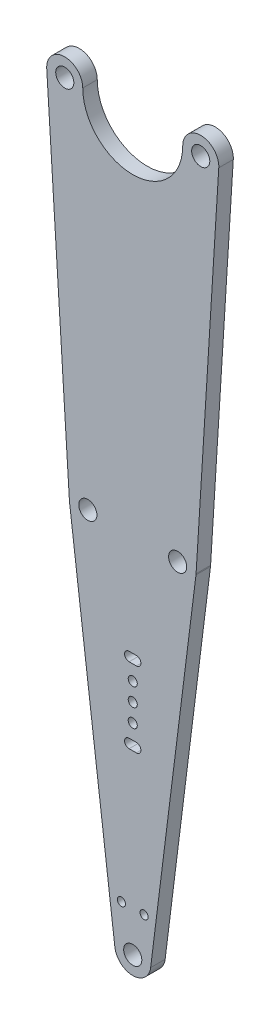
ISO-10303-21;
HEADER;
FILE_DESCRIPTION(('STEP AP214'),'2;1');
FILE_NAME('part.step','',(''),(''),'','','');
FILE_SCHEMA(('AUTOMOTIVE_DESIGN { 1 0 10303 214 1 1 1 1 }'));
ENDSEC;
DATA;
#1=APPLICATION_CONTEXT('core data for automotive mechanical design processes');
#2=APPLICATION_PROTOCOL_DEFINITION('international standard','automotive_design',2000,#1);
#3=PRODUCT_CONTEXT('',#1,'mechanical');
#4=PRODUCT('Part','Part','',(#3));
#5=PRODUCT_RELATED_PRODUCT_CATEGORY('part','',(#4));
#6=PRODUCT_DEFINITION_FORMATION('','',#4);
#7=PRODUCT_DEFINITION_CONTEXT('part definition',#1,'design');
#8=PRODUCT_DEFINITION('design','',#6,#7);
#9=PRODUCT_DEFINITION_SHAPE('','',#8);
#10=(LENGTH_UNIT() NAMED_UNIT(*) SI_UNIT(.MILLI.,.METRE.));
#11=(NAMED_UNIT(*) PLANE_ANGLE_UNIT() SI_UNIT($,.RADIAN.));
#12=(NAMED_UNIT(*) SI_UNIT($,.STERADIAN.) SOLID_ANGLE_UNIT());
#13=UNCERTAINTY_MEASURE_WITH_UNIT(LENGTH_MEASURE(1.E-05),#10,'distance_accuracy_value','');
#14=(GEOMETRIC_REPRESENTATION_CONTEXT(3) GLOBAL_UNCERTAINTY_ASSIGNED_CONTEXT((#13)) GLOBAL_UNIT_ASSIGNED_CONTEXT((#10,
#11,#12)) REPRESENTATION_CONTEXT('',''));
#15=CARTESIAN_POINT('',(0.,0.,0.));
#16=DIRECTION('',(0.,0.,1.));
#17=DIRECTION('',(1.,0.,0.));
#18=AXIS2_PLACEMENT_3D('',#15,#16,#17);
#19=CARTESIAN_POINT('',(5.000035618539,-1.44669403776E-06,0.));
#20=DIRECTION('',(0.,0.,-1.));
#21=DIRECTION('',(-1.,0.,0.));
#22=AXIS2_PLACEMENT_3D('',#19,#20,#21);
#23=CYLINDRICAL_SURFACE('',#22,1.987278077217);
#24=DIRECTION('',(0.,0.,1.));
#25=VECTOR('',#24,1.);
#26=CARTESIAN_POINT('',(6.971967516009,-0.246494342993,0.));
#27=LINE('',#26,#25);
#28=CARTESIAN_POINT('',(6.97196760272381,-0.246493649274497,0.));
#29=VERTEX_POINT('',#28);
#30=CARTESIAN_POINT('',(6.97196760272378,-0.246493649274763,1.600050800102));
#31=VERTEX_POINT('',#30);
#32=EDGE_CURVE('E144',#29,#31,#27,.T.);
#33=ORIENTED_EDGE('',*,*,#32,.F.);
#34=CARTESIAN_POINT('',(5.000035618539,-1.44669403776E-06,0.));
#35=DIRECTION('',(0.,0.,-1.));
#36=DIRECTION('',(-1.,0.,0.));
#37=AXIS2_PLACEMENT_3D('',#34,#35,#36);
#38=CIRCLE('',#37,1.987278077217);
#39=CARTESIAN_POINT('',(6.98344360355803,-0.123964833015268,0.));
#40=VERTEX_POINT('',#39);
#41=EDGE_CURVE('E234',#40,#29,#38,.T.);
#42=ORIENTED_EDGE('',*,*,#41,.F.);
#43=DIRECTION('',(0.,0.,1.));
#44=VECTOR('',#43,1.);
#45=CARTESIAN_POINT('',(6.98344357944861,-0.123965218765981,0.));
#46=LINE('',#45,#44);
#47=CARTESIAN_POINT('',(6.98344360355823,-0.123964833015269,1.600050800102));
#48=VERTEX_POINT('',#47);
#49=EDGE_CURVE('E145',#48,#40,#46,.F.);
#50=ORIENTED_EDGE('',*,*,#49,.F.);
#51=CARTESIAN_POINT('',(5.000035618539,-1.44669403776E-06,1.600050800102));
#52=DIRECTION('',(0.,0.,-1.));
#53=DIRECTION('',(-1.,0.,0.));
#54=AXIS2_PLACEMENT_3D('',#51,#52,#53);
#55=CIRCLE('',#54,1.987278077217);
#56=EDGE_CURVE('E19',#48,#31,#55,.T.);
#57=ORIENTED_EDGE('',*,*,#56,.T.);
#58=EDGE_LOOP('',(#33,#42,#50,#57));
#59=FACE_BOUND('',#58,.T.);
#60=ADVANCED_FACE('F16',(#59),#23,.T.);
#61=CARTESIAN_POINT('',(-5.000035618539,-1.44669404889E-06,0.));
#62=DIRECTION('',(0.,0.,-1.));
#63=DIRECTION('',(-1.,0.,0.));
#64=AXIS2_PLACEMENT_3D('',#61,#62,#63);
#65=CYLINDRICAL_SURFACE('',#64,1.987278077217);
#66=DIRECTION('',(0.,0.,1.));
#67=VECTOR('',#66,1.);
#68=CARTESIAN_POINT('',(-6.983443579449,-0.123965218766,0.));
#69=LINE('',#68,#67);
#70=CARTESIAN_POINT('',(-6.98344360355842,-0.123964833015293,0.));
#71=VERTEX_POINT('',#70);
#72=CARTESIAN_POINT('',(-6.98344360355842,-0.123964833015284,1.600050800102));
#73=VERTEX_POINT('',#72);
#74=EDGE_CURVE('E206',#71,#73,#69,.T.);
#75=ORIENTED_EDGE('',*,*,#74,.F.);
#76=CARTESIAN_POINT('',(-5.000035618539,-1.44669404889E-06,0.));
#77=DIRECTION('',(0.,0.,-1.));
#78=DIRECTION('',(-1.,0.,0.));
#79=AXIS2_PLACEMENT_3D('',#76,#77,#78);
#80=CIRCLE('',#79,1.987278077217);
#81=CARTESIAN_POINT('',(-6.97196760271303,-0.246493649273146,0.));
#82=VERTEX_POINT('',#81);
#83=EDGE_CURVE('E232',#82,#71,#80,.T.);
#84=ORIENTED_EDGE('',*,*,#83,.F.);
#85=DIRECTION('',(0.,0.,1.));
#86=VECTOR('',#85,1.);
#87=CARTESIAN_POINT('',(-6.97196751599822,-0.246494342991635,0.));
#88=LINE('',#87,#86);
#89=CARTESIAN_POINT('',(-6.97196760272108,-0.246493649274424,1.600050800102));
#90=VERTEX_POINT('',#89);
#91=EDGE_CURVE('E212',#90,#82,#88,.F.);
#92=ORIENTED_EDGE('',*,*,#91,.F.);
#93=CARTESIAN_POINT('',(-5.000035618539,-1.44669404889E-06,1.600050800102));
#94=DIRECTION('',(0.,0.,-1.));
#95=DIRECTION('',(-1.,0.,0.));
#96=AXIS2_PLACEMENT_3D('',#93,#94,#95);
#97=CIRCLE('',#96,1.987278077217);
#98=EDGE_CURVE('E147',#90,#73,#97,.T.);
#99=ORIENTED_EDGE('',*,*,#98,.T.);
#100=EDGE_LOOP('',(#75,#84,#92,#99));
#101=FACE_BOUND('',#100,.T.);
#102=ADVANCED_FACE('F343',(#101),#65,.T.);
#103=CARTESIAN_POINT('',(0.4,-11.22512065024,0.));
#104=DIRECTION('',(0.,-1.,0.));
#105=DIRECTION('',(0.,0.,-1.));
#106=AXIS2_PLACEMENT_3D('',#103,#104,#105);
#107=PLANE('',#106);
#108=DIRECTION('',(0.,0.,-1.));
#109=VECTOR('',#108,1.);
#110=CARTESIAN_POINT('',(-0.4,-11.22512065024,0.));
#111=LINE('',#110,#109);
#112=CARTESIAN_POINT('',(-0.4,-11.22512065024,1.600050800102));
#113=VERTEX_POINT('',#112);
#114=CARTESIAN_POINT('',(-0.4,-11.22512065024,0.));
#115=VERTEX_POINT('',#114);
#116=EDGE_CURVE('E195',#113,#115,#111,.T.);
#117=ORIENTED_EDGE('',*,*,#116,.T.);
#118=DIRECTION('',(-1.,0.,0.));
#119=VECTOR('',#118,1.);
#120=CARTESIAN_POINT('',(0.,-11.22512065024,0.));
#121=LINE('',#120,#119);
#122=CARTESIAN_POINT('',(0.4,-11.22512065024,0.));
#123=VERTEX_POINT('',#122);
#124=EDGE_CURVE('E230',#123,#115,#121,.T.);
#125=ORIENTED_EDGE('',*,*,#124,.F.);
#126=DIRECTION('',(0.,0.,-1.));
#127=VECTOR('',#126,1.);
#128=CARTESIAN_POINT('',(0.4,-11.22512065024,0.));
#129=LINE('',#128,#127);
#130=CARTESIAN_POINT('',(0.4,-11.22512065024,1.600050800102));
#131=VERTEX_POINT('',#130);
#132=EDGE_CURVE('E185',#123,#131,#129,.F.);
#133=ORIENTED_EDGE('',*,*,#132,.T.);
#134=DIRECTION('',(1.,0.,0.));
#135=VECTOR('',#134,1.);
#136=CARTESIAN_POINT('',(0.4,-11.22512065024,1.600050800102));
#137=LINE('',#136,#135);
#138=EDGE_CURVE('E239',#131,#113,#137,.F.);
#139=ORIENTED_EDGE('',*,*,#138,.T.);
#140=EDGE_LOOP('',(#117,#125,#133,#139));
#141=FACE_BOUND('',#140,.T.);
#142=ADVANCED_FACE('F472',(#141),#107,.T.);
#143=CARTESIAN_POINT('',(-0.4,-12.22512065024,0.));
#144=DIRECTION('',(0.,1.,0.));
#145=DIRECTION('',(0.,0.,1.));
#146=AXIS2_PLACEMENT_3D('',#143,#144,#145);
#147=PLANE('',#146);
#148=DIRECTION('',(0.,0.,-1.));
#149=VECTOR('',#148,1.);
#150=CARTESIAN_POINT('',(0.4,-12.22512065024,0.));
#151=LINE('',#150,#149);
#152=CARTESIAN_POINT('',(0.4,-12.22512065024,1.600050800102));
#153=VERTEX_POINT('',#152);
#154=CARTESIAN_POINT('',(0.4,-12.22512065024,0.));
#155=VERTEX_POINT('',#154);
#156=EDGE_CURVE('E188',#153,#155,#151,.T.);
#157=ORIENTED_EDGE('',*,*,#156,.T.);
#158=DIRECTION('',(-1.,0.,0.));
#159=VECTOR('',#158,1.);
#160=CARTESIAN_POINT('',(0.,-12.22512065024,0.));
#161=LINE('',#160,#159);
#162=CARTESIAN_POINT('',(-0.4,-12.22512065024,0.));
#163=VERTEX_POINT('',#162);
#164=EDGE_CURVE('E228',#163,#155,#161,.F.);
#165=ORIENTED_EDGE('',*,*,#164,.F.);
#166=DIRECTION('',(0.,0.,-1.));
#167=VECTOR('',#166,1.);
#168=CARTESIAN_POINT('',(-0.4,-12.22512065024,0.));
#169=LINE('',#168,#167);
#170=CARTESIAN_POINT('',(-0.4,-12.22512065024,1.600050800102));
#171=VERTEX_POINT('',#170);
#172=EDGE_CURVE('E192',#163,#171,#169,.F.);
#173=ORIENTED_EDGE('',*,*,#172,.T.);
#174=DIRECTION('',(1.,0.,0.));
#175=VECTOR('',#174,1.);
#176=CARTESIAN_POINT('',(-0.4,-12.22512065024,1.600050800102));
#177=LINE('',#176,#175);
#178=EDGE_CURVE('E237',#171,#153,#177,.T.);
#179=ORIENTED_EDGE('',*,*,#178,.T.);
#180=EDGE_LOOP('',(#157,#165,#173,#179));
#181=FACE_BOUND('',#180,.T.);
#182=ADVANCED_FACE('F468',(#181),#147,.T.);
#183=CARTESIAN_POINT('',(0.4,-19.52494284988,0.));
#184=DIRECTION('',(0.,-1.,0.));
#185=DIRECTION('',(0.,0.,-1.));
#186=AXIS2_PLACEMENT_3D('',#183,#184,#185);
#187=PLANE('',#186);
#188=DIRECTION('',(0.,0.,-1.));
#189=VECTOR('',#188,1.);
#190=CARTESIAN_POINT('',(-0.4,-19.52494284988,0.));
#191=LINE('',#190,#189);
#192=CARTESIAN_POINT('',(-0.4,-19.52494284988,1.600050800102));
#193=VERTEX_POINT('',#192);
#194=CARTESIAN_POINT('',(-0.4,-19.52494284988,0.));
#195=VERTEX_POINT('',#194);
#196=EDGE_CURVE('E181',#193,#195,#191,.T.);
#197=ORIENTED_EDGE('',*,*,#196,.T.);
#198=DIRECTION('',(-1.,0.,0.));
#199=VECTOR('',#198,1.);
#200=CARTESIAN_POINT('',(0.,-19.52494284988,0.));
#201=LINE('',#200,#199);
#202=CARTESIAN_POINT('',(0.4,-19.52494284988,0.));
#203=VERTEX_POINT('',#202);
#204=EDGE_CURVE('E226',#203,#195,#201,.T.);
#205=ORIENTED_EDGE('',*,*,#204,.F.);
#206=DIRECTION('',(0.,0.,-1.));
#207=VECTOR('',#206,1.);
#208=CARTESIAN_POINT('',(0.4,-19.52494284988,0.));
#209=LINE('',#208,#207);
#210=CARTESIAN_POINT('',(0.4,-19.52494284988,1.600050800102));
#211=VERTEX_POINT('',#210);
#212=EDGE_CURVE('E172',#203,#211,#209,.F.);
#213=ORIENTED_EDGE('',*,*,#212,.T.);
#214=DIRECTION('',(1.,0.,0.));
#215=VECTOR('',#214,1.);
#216=CARTESIAN_POINT('',(0.4,-19.52494284988,1.600050800102));
#217=LINE('',#216,#215);
#218=EDGE_CURVE('E235',#211,#193,#217,.F.);
#219=ORIENTED_EDGE('',*,*,#218,.T.);
#220=EDGE_LOOP('',(#197,#205,#213,#219));
#221=FACE_BOUND('',#220,.T.);
#222=ADVANCED_FACE('F461',(#221),#187,.T.);
#223=CARTESIAN_POINT('',(-0.4,-20.52494284988,0.));
#224=DIRECTION('',(0.,1.,0.));
#225=DIRECTION('',(0.,0.,1.));
#226=AXIS2_PLACEMENT_3D('',#223,#224,#225);
#227=PLANE('',#226);
#228=DIRECTION('',(0.,0.,-1.));
#229=VECTOR('',#228,1.);
#230=CARTESIAN_POINT('',(0.4,-20.52494284988,0.));
#231=LINE('',#230,#229);
#232=CARTESIAN_POINT('',(0.4,-20.52494284988,1.600050800102));
#233=VERTEX_POINT('',#232);
#234=CARTESIAN_POINT('',(0.4,-20.52494284988,0.));
#235=VERTEX_POINT('',#234);
#236=EDGE_CURVE('E175',#233,#235,#231,.T.);
#237=ORIENTED_EDGE('',*,*,#236,.T.);
#238=DIRECTION('',(-1.,0.,0.));
#239=VECTOR('',#238,1.);
#240=CARTESIAN_POINT('',(0.,-20.52494284988,0.));
#241=LINE('',#240,#239);
#242=CARTESIAN_POINT('',(-0.4,-20.52494284988,0.));
#243=VERTEX_POINT('',#242);
#244=EDGE_CURVE('E224',#243,#235,#241,.F.);
#245=ORIENTED_EDGE('',*,*,#244,.F.);
#246=DIRECTION('',(0.,0.,-1.));
#247=VECTOR('',#246,1.);
#248=CARTESIAN_POINT('',(-0.4,-20.52494284988,0.));
#249=LINE('',#248,#247);
#250=CARTESIAN_POINT('',(-0.4,-20.52494284988,1.600050800102));
#251=VERTEX_POINT('',#250);
#252=EDGE_CURVE('E179',#243,#251,#249,.F.);
#253=ORIENTED_EDGE('',*,*,#252,.T.);
#254=DIRECTION('',(1.,0.,0.));
#255=VECTOR('',#254,1.);
#256=CARTESIAN_POINT('',(-0.4,-20.52494284988,1.600050800102));
#257=LINE('',#256,#255);
#258=EDGE_CURVE('E34',#251,#233,#257,.T.);
#259=ORIENTED_EDGE('',*,*,#258,.T.);
#260=EDGE_LOOP('',(#237,#245,#253,#259));
#261=FACE_BOUND('',#260,.T.);
#262=ADVANCED_FACE('F451',(#261),#227,.T.);
#263=CARTESIAN_POINT('',(0.,4.306260721372,0.));
#264=DIRECTION('',(0.,0.,-1.));
#265=DIRECTION('',(-1.,0.,0.));
#266=AXIS2_PLACEMENT_3D('',#263,#264,#265);
#267=PLANE('',#266);
#268=CARTESIAN_POINT('',(7.49301498603,40.00508001016,0.));
#269=DIRECTION('',(0.,0.,-1.));
#270=DIRECTION('',(-1.,0.,0.));
#271=AXIS2_PLACEMENT_3D('',#268,#269,#270);
#272=CIRCLE('',#271,1.000002540005);
#273=CARTESIAN_POINT('',(6.493012446025,40.00508001016,0.));
#274=VERTEX_POINT('',#273);
#275=EDGE_CURVE('E295',#274,#274,#272,.F.);
#276=ORIENTED_EDGE('',*,*,#275,.T.);
#277=EDGE_LOOP('',(#276));
#278=FACE_BOUND('',#277,.T.);
#279=CARTESIAN_POINT('',(4.95300990602,0.,0.));
#280=DIRECTION('',(0.,0.,-1.));
#281=DIRECTION('',(-1.,0.,0.));
#282=AXIS2_PLACEMENT_3D('',#279,#280,#281);
#283=CIRCLE('',#282,1.000002540005);
#284=CARTESIAN_POINT('',(3.953007366015,0.,0.));
#285=VERTEX_POINT('',#284);
#286=EDGE_CURVE('E298',#285,#285,#283,.F.);
#287=ORIENTED_EDGE('',*,*,#286,.T.);
#288=EDGE_LOOP('',(#287));
#289=FACE_BOUND('',#288,.T.);
#290=CARTESIAN_POINT('',(1.249936499873,-35.56007112014,0.));
#291=DIRECTION('',(0.,0.,-1.));
#292=DIRECTION('',(-1.,0.,0.));
#293=AXIS2_PLACEMENT_3D('',#290,#291,#292);
#294=CIRCLE('',#293,0.450012700025);
#295=CARTESIAN_POINT('',(0.799923799848,-35.56007112014,0.));
#296=VERTEX_POINT('',#295);
#297=EDGE_CURVE('E301',#296,#296,#294,.F.);
#298=ORIENTED_EDGE('',*,*,#297,.T.);
#299=EDGE_LOOP('',(#298));
#300=FACE_BOUND('',#299,.T.);
#301=CARTESIAN_POINT('',(0.,-17.87503175006,0.));
#302=DIRECTION('',(0.,0.,-1.));
#303=DIRECTION('',(-1.,0.,0.));
#304=AXIS2_PLACEMENT_3D('',#301,#302,#303);
#305=CIRCLE('',#304,0.5);
#306=CARTESIAN_POINT('',(-0.5,-17.87503175006,0.));
#307=VERTEX_POINT('',#306);
#308=EDGE_CURVE('E304',#307,#307,#305,.F.);
#309=ORIENTED_EDGE('',*,*,#308,.T.);
#310=EDGE_LOOP('',(#309));
#311=FACE_BOUND('',#310,.T.);
#312=CARTESIAN_POINT('',(0.,-15.87503175006,0.));
#313=DIRECTION('',(0.,0.,-1.));
#314=DIRECTION('',(-1.,0.,0.));
#315=AXIS2_PLACEMENT_3D('',#312,#313,#314);
#316=CIRCLE('',#315,0.5);
#317=CARTESIAN_POINT('',(-0.5,-15.87503175006,0.));
#318=VERTEX_POINT('',#317);
#319=EDGE_CURVE('E307',#318,#318,#316,.F.);
#320=ORIENTED_EDGE('',*,*,#319,.T.);
#321=EDGE_LOOP('',(#320));
#322=FACE_BOUND('',#321,.T.);
#323=CARTESIAN_POINT('',(0.,-13.87503175006,0.));
#324=DIRECTION('',(0.,0.,-1.));
#325=DIRECTION('',(-1.,0.,0.));
#326=AXIS2_PLACEMENT_3D('',#323,#324,#325);
#327=CIRCLE('',#326,0.5);
#328=CARTESIAN_POINT('',(-0.5,-13.87503175006,0.));
#329=VERTEX_POINT('',#328);
#330=EDGE_CURVE('E178',#329,#329,#327,.F.);
#331=ORIENTED_EDGE('',*,*,#330,.T.);
#332=EDGE_LOOP('',(#331));
#333=FACE_BOUND('',#332,.T.);
#334=ORIENTED_EDGE('',*,*,#244,.T.);
#335=CARTESIAN_POINT('',(0.4,-20.02494284988,0.));
#336=DIRECTION('',(0.,0.,-1.));
#337=DIRECTION('',(-1.,0.,0.));
#338=AXIS2_PLACEMENT_3D('',#335,#336,#337);
#339=CIRCLE('',#338,0.5);
#340=EDGE_CURVE('E176',#235,#203,#339,.F.);
#341=ORIENTED_EDGE('',*,*,#340,.T.);
#342=ORIENTED_EDGE('',*,*,#204,.T.);
#343=CARTESIAN_POINT('',(-0.4,-20.02494284988,0.));
#344=DIRECTION('',(0.,0.,-1.));
#345=DIRECTION('',(-1.,0.,0.));
#346=AXIS2_PLACEMENT_3D('',#343,#344,#345);
#347=CIRCLE('',#346,0.5);
#348=EDGE_CURVE('E182',#195,#243,#347,.F.);
#349=ORIENTED_EDGE('',*,*,#348,.T.);
#350=EDGE_LOOP('',(#334,#341,#342,#349));
#351=FACE_BOUND('',#350,.T.);
#352=ORIENTED_EDGE('',*,*,#164,.T.);
#353=CARTESIAN_POINT('',(0.4,-11.72512065024,0.));
#354=DIRECTION('',(0.,0.,-1.));
#355=DIRECTION('',(-1.,0.,0.));
#356=AXIS2_PLACEMENT_3D('',#353,#354,#355);
#357=CIRCLE('',#356,0.5);
#358=EDGE_CURVE('E189',#155,#123,#357,.F.);
#359=ORIENTED_EDGE('',*,*,#358,.T.);
#360=ORIENTED_EDGE('',*,*,#124,.T.);
#361=CARTESIAN_POINT('',(-0.4,-11.72512065024,0.));
#362=DIRECTION('',(0.,0.,-1.));
#363=DIRECTION('',(-1.,0.,0.));
#364=AXIS2_PLACEMENT_3D('',#361,#362,#363);
#365=CIRCLE('',#364,0.5);
#366=EDGE_CURVE('E196',#115,#163,#365,.F.);
#367=ORIENTED_EDGE('',*,*,#366,.T.);
#368=EDGE_LOOP('',(#352,#359,#360,#367));
#369=FACE_BOUND('',#368,.T.);
#370=CARTESIAN_POINT('',(0.,-40.00508001016,0.));
#371=DIRECTION('',(0.,0.,-1.));
#372=DIRECTION('',(-1.,0.,0.));
#373=AXIS2_PLACEMENT_3D('',#370,#371,#372);
#374=CIRCLE('',#373,1.000002540005);
#375=CARTESIAN_POINT('',(-1.000002540005,-40.00508001016,0.));
#376=VERTEX_POINT('',#375);
#377=EDGE_CURVE('E320',#376,#376,#374,.F.);
#378=ORIENTED_EDGE('',*,*,#377,.T.);
#379=EDGE_LOOP('',(#378));
#380=FACE_BOUND('',#379,.T.);
#381=CARTESIAN_POINT('',(-1.249987299975,-35.56007112014,0.));
#382=DIRECTION('',(0.,0.,-1.));
#383=DIRECTION('',(-1.,0.,0.));
#384=AXIS2_PLACEMENT_3D('',#381,#382,#383);
#385=CIRCLE('',#384,0.450012700025);
#386=CARTESIAN_POINT('',(-1.7,-35.56007112014,0.));
#387=VERTEX_POINT('',#386);
#388=EDGE_CURVE('E323',#387,#387,#385,.F.);
#389=ORIENTED_EDGE('',*,*,#388,.T.);
#390=EDGE_LOOP('',(#389));
#391=FACE_BOUND('',#390,.T.);
#392=CARTESIAN_POINT('',(-4.95300990602,0.,0.));
#393=DIRECTION('',(0.,0.,-1.));
#394=DIRECTION('',(-1.,0.,0.));
#395=AXIS2_PLACEMENT_3D('',#392,#393,#394);
#396=CIRCLE('',#395,1.000002540005);
#397=CARTESIAN_POINT('',(-5.953012446025,0.,0.));
#398=VERTEX_POINT('',#397);
#399=EDGE_CURVE('E326',#398,#398,#396,.F.);
#400=ORIENTED_EDGE('',*,*,#399,.T.);
#401=EDGE_LOOP('',(#400));
#402=FACE_BOUND('',#401,.T.);
#403=CARTESIAN_POINT('',(-7.49301498603,40.00508001016,0.));
#404=DIRECTION('',(0.,0.,-1.));
#405=DIRECTION('',(-1.,0.,0.));
#406=AXIS2_PLACEMENT_3D('',#403,#404,#405);
#407=CIRCLE('',#406,1.000002540005);
#408=CARTESIAN_POINT('',(-8.493017526035,40.00508001016,0.));
#409=VERTEX_POINT('',#408);
#410=EDGE_CURVE('E329',#409,#409,#407,.F.);
#411=ORIENTED_EDGE('',*,*,#410,.T.);
#412=EDGE_LOOP('',(#411));
#413=FACE_BOUND('',#412,.T.);
#414=DIRECTION('',(0.0623782861551731,-0.998052578482889,0.));
#415=VECTOR('',#414,1.);
#416=CARTESIAN_POINT('',(-6.983443579449,-0.123965218766,0.));
#417=LINE('',#416,#415);
#418=CARTESIAN_POINT('',(-9.48344860967983,39.8761152649299,0.));
#419=VERTEX_POINT('',#418);
#420=EDGE_CURVE('E202',#419,#71,#417,.T.);
#421=ORIENTED_EDGE('',*,*,#420,.F.);
#422=CARTESIAN_POINT('',(-7.500014432653,40.000079116394,0.));
#423=DIRECTION('',(0.,0.,-1.));
#424=DIRECTION('',(-1.,0.,0.));
#425=AXIS2_PLACEMENT_3D('',#422,#423,#424);
#426=CIRCLE('',#425,1.987304247233);
#427=CARTESIAN_POINT('',(-5.51271018542002,40.0000788799407,0.));
#428=VERTEX_POINT('',#427);
#429=EDGE_CURVE('E205',#428,#419,#426,.F.);
#430=ORIENTED_EDGE('',*,*,#429,.F.);
#431=CARTESIAN_POINT('',(0.,40.000078742547,0.));
#432=DIRECTION('',(0.,0.,-1.));
#433=DIRECTION('',(-1.,0.,0.));
#434=AXIS2_PLACEMENT_3D('',#431,#432,#433);
#435=CIRCLE('',#434,5.51271018542);
#436=CARTESIAN_POINT('',(5.51271018542,40.0000790668642,0.));
#437=VERTEX_POINT('',#436);
#438=EDGE_CURVE('E223',#428,#437,#435,.F.);
#439=ORIENTED_EDGE('',*,*,#438,.T.);
#440=CARTESIAN_POINT('',(7.500014432653,40.000079116394,0.));
#441=DIRECTION('',(0.,0.,-1.));
#442=DIRECTION('',(-1.,0.,0.));
#443=AXIS2_PLACEMENT_3D('',#440,#441,#442);
#444=CIRCLE('',#443,1.987304247233);
#445=CARTESIAN_POINT('',(9.48344860967931,39.8761152649299,0.));
#446=VERTEX_POINT('',#445);
#447=EDGE_CURVE('E219',#446,#437,#444,.F.);
#448=ORIENTED_EDGE('',*,*,#447,.F.);
#449=DIRECTION('',(0.0623782861551731,0.998052578482889,0.));
#450=VECTOR('',#449,1.);
#451=CARTESIAN_POINT('',(9.483448658526,39.876116046477,0.));
#452=LINE('',#451,#450);
#453=EDGE_CURVE('E155',#40,#446,#452,.T.);
#454=ORIENTED_EDGE('',*,*,#453,.F.);
#455=ORIENTED_EDGE('',*,*,#41,.T.);
#456=DIRECTION('',(0.124034734588962,0.992277876713698,0.));
#457=VECTOR('',#456,1.);
#458=CARTESIAN_POINT('',(6.971967516009,-0.246494342993,0.));
#459=LINE('',#458,#457);
#460=CARTESIAN_POINT('',(1.97195731926884,-40.2465759169514,0.));
#461=VERTEX_POINT('',#460);
#462=EDGE_CURVE('E154',#461,#29,#459,.T.);
#463=ORIENTED_EDGE('',*,*,#462,.F.);
#464=CARTESIAN_POINT('',(0.,-40.00008153778,0.));
#465=DIRECTION('',(0.,0.,-1.));
#466=DIRECTION('',(-1.,0.,0.));
#467=AXIS2_PLACEMENT_3D('',#464,#465,#466);
#468=CIRCLE('',#467,1.987303486627);
#469=CARTESIAN_POINT('',(-1.97195731926341,-40.2465759169507,0.));
#470=VERTEX_POINT('',#469);
#471=EDGE_CURVE('E213',#470,#461,#468,.F.);
#472=ORIENTED_EDGE('',*,*,#471,.F.);
#473=DIRECTION('',(0.124034734588962,-0.992277876713698,0.));
#474=VECTOR('',#473,1.);
#475=CARTESIAN_POINT('',(-1.971957354431,-40.24657563561,0.));
#476=LINE('',#475,#474);
#477=EDGE_CURVE('E209',#82,#470,#476,.T.);
#478=ORIENTED_EDGE('',*,*,#477,.F.);
#479=ORIENTED_EDGE('',*,*,#83,.T.);
#480=EDGE_LOOP('',(#421,#430,#439,#448,#454,#455,#463,#472,#478,#479));
#481=FACE_BOUND('',#480,.T.);
#482=ADVANCED_FACE('F358',(#278,#289,#300,#311,#322,#333,#351,#369,#380,#391,#402,#413,#481),
#267,.T.);
#483=CARTESIAN_POINT('',(0.,40.000078742547,0.));
#484=DIRECTION('',(0.,0.,-1.));
#485=DIRECTION('',(-1.,0.,0.));
#486=AXIS2_PLACEMENT_3D('',#483,#484,#485);
#487=CYLINDRICAL_SURFACE('',#486,5.51271018542);
#488=CARTESIAN_POINT('',(0.,40.000078742547,1.600050800102));
#489=DIRECTION('',(0.,0.,-1.));
#490=DIRECTION('',(-1.,0.,0.));
#491=AXIS2_PLACEMENT_3D('',#488,#489,#490);
#492=CIRCLE('',#491,5.51271018542);
#493=CARTESIAN_POINT('',(-5.51271018542002,40.0000788799407,1.600050800102));
#494=VERTEX_POINT('',#493);
#495=CARTESIAN_POINT('',(5.51271018542,40.0000790668642,1.600050800102));
#496=VERTEX_POINT('',#495);
#497=EDGE_CURVE('E292',#494,#496,#492,.F.);
#498=ORIENTED_EDGE('',*,*,#497,.T.);
#499=DIRECTION('',(0.,0.,-1.));
#500=VECTOR('',#499,1.);
#501=CARTESIAN_POINT('',(5.51271018542,40.000079116394,0.));
#502=LINE('',#501,#500);
#503=EDGE_CURVE('E221',#437,#496,#502,.F.);
#504=ORIENTED_EDGE('',*,*,#503,.F.);
#505=ORIENTED_EDGE('',*,*,#438,.F.);
#506=DIRECTION('',(0.,0.,-1.));
#507=VECTOR('',#506,1.);
#508=CARTESIAN_POINT('',(-5.51271018542004,40.000078742547,0.));
#509=LINE('',#508,#507);
#510=EDGE_CURVE('E201',#494,#428,#509,.T.);
#511=ORIENTED_EDGE('',*,*,#510,.F.);
#512=EDGE_LOOP('',(#498,#504,#505,#511));
#513=FACE_BOUND('',#512,.T.);
#514=ADVANCED_FACE('F369',(#513),#487,.F.);
#515=CARTESIAN_POINT('',(7.500014432653,40.000079116394,0.));
#516=DIRECTION('',(0.,0.,-1.));
#517=DIRECTION('',(-1.,0.,0.));
#518=AXIS2_PLACEMENT_3D('',#515,#516,#517);
#519=CYLINDRICAL_SURFACE('',#518,1.987304247233);
#520=DIRECTION('',(0.,0.,1.));
#521=VECTOR('',#520,1.);
#522=CARTESIAN_POINT('',(9.483448658526,39.876116046477,0.));
#523=LINE('',#522,#521);
#524=CARTESIAN_POINT('',(9.48344860967931,39.8761152649299,1.600050800102));
#525=VERTEX_POINT('',#524);
#526=EDGE_CURVE('E217',#446,#525,#523,.T.);
#527=ORIENTED_EDGE('',*,*,#526,.F.);
#528=ORIENTED_EDGE('',*,*,#447,.T.);
#529=ORIENTED_EDGE('',*,*,#503,.T.);
#530=CARTESIAN_POINT('',(7.500014432653,40.000079116394,1.600050800102));
#531=DIRECTION('',(0.,0.,-1.));
#532=DIRECTION('',(-1.,0.,0.));
#533=AXIS2_PLACEMENT_3D('',#530,#531,#532);
#534=CIRCLE('',#533,1.987304247233);
#535=EDGE_CURVE('E167',#496,#525,#534,.T.);
#536=ORIENTED_EDGE('',*,*,#535,.T.);
#537=EDGE_LOOP('',(#527,#528,#529,#536));
#538=FACE_BOUND('',#537,.T.);
#539=ADVANCED_FACE('F364',(#538),#519,.T.);
#540=CARTESIAN_POINT('',(9.483448658526,39.876116046477,0.));
#541=DIRECTION('',(0.998052578482889,-0.0623782861551731,0.));
#542=DIRECTION('',(0.0623782861551731,0.998052578482889,0.));
#543=AXIS2_PLACEMENT_3D('',#540,#541,#542);
#544=PLANE('',#543);
#545=ORIENTED_EDGE('',*,*,#49,.T.);
#546=ORIENTED_EDGE('',*,*,#453,.T.);
#547=ORIENTED_EDGE('',*,*,#526,.T.);
#548=DIRECTION('',(-0.0623782861551634,-0.99805257848289,0.));
#549=VECTOR('',#548,1.);
#550=CARTESIAN_POINT('',(9.483448658526,39.876116046477,1.600050800102));
#551=LINE('',#550,#549);
#552=EDGE_CURVE('E163',#525,#48,#551,.T.);
#553=ORIENTED_EDGE('',*,*,#552,.T.);
#554=EDGE_LOOP('',(#545,#546,#547,#553));
#555=FACE_BOUND('',#554,.T.);
#556=ADVANCED_FACE('F362',(#555),#544,.T.);
#557=CARTESIAN_POINT('',(6.971967516009,-0.246494342993,0.));
#558=DIRECTION('',(0.992277876713698,-0.124034734588962,0.));
#559=DIRECTION('',(0.124034734588962,0.992277876713698,0.));
#560=AXIS2_PLACEMENT_3D('',#557,#558,#559);
#561=PLANE('',#560);
#562=DIRECTION('',(0.,0.,-1.));
#563=VECTOR('',#562,1.);
#564=CARTESIAN_POINT('',(1.97195735443107,-40.24657563561,0.));
#565=LINE('',#564,#563);
#566=CARTESIAN_POINT('',(1.97195731926339,-40.246575916951,1.600050800102));
#567=VERTEX_POINT('',#566);
#568=EDGE_CURVE('E215',#461,#567,#565,.F.);
#569=ORIENTED_EDGE('',*,*,#568,.F.);
#570=ORIENTED_EDGE('',*,*,#462,.T.);
#571=ORIENTED_EDGE('',*,*,#32,.T.);
#572=DIRECTION('',(-0.12403473458923,-0.992277876713665,0.));
#573=VECTOR('',#572,1.);
#574=CARTESIAN_POINT('',(6.971967516009,-0.246494342993,1.600050800102));
#575=LINE('',#574,#573);
#576=EDGE_CURVE('E153',#31,#567,#575,.T.);
#577=ORIENTED_EDGE('',*,*,#576,.T.);
#578=EDGE_LOOP('',(#569,#570,#571,#577));
#579=FACE_BOUND('',#578,.T.);
#580=ADVANCED_FACE('F152',(#579),#561,.T.);
#581=CARTESIAN_POINT('',(0.,-40.00008153778,0.));
#582=DIRECTION('',(0.,0.,-1.));
#583=DIRECTION('',(-1.,0.,0.));
#584=AXIS2_PLACEMENT_3D('',#581,#582,#583);
#585=CYLINDRICAL_SURFACE('',#584,1.987303486627);
#586=DIRECTION('',(0.,0.,1.));
#587=VECTOR('',#586,1.);
#588=CARTESIAN_POINT('',(-1.971957354431,-40.24657563561,0.));
#589=LINE('',#588,#587);
#590=CARTESIAN_POINT('',(-1.97195731926337,-40.246575916951,1.600050800102));
#591=VERTEX_POINT('',#590);
#592=EDGE_CURVE('E210',#470,#591,#589,.T.);
#593=ORIENTED_EDGE('',*,*,#592,.F.);
#594=ORIENTED_EDGE('',*,*,#471,.T.);
#595=ORIENTED_EDGE('',*,*,#568,.T.);
#596=CARTESIAN_POINT('',(0.,-40.00008153778,1.600050800102));
#597=DIRECTION('',(0.,0.,-1.));
#598=DIRECTION('',(-1.,0.,0.));
#599=AXIS2_PLACEMENT_3D('',#596,#597,#598);
#600=CIRCLE('',#599,1.987303486627);
#601=EDGE_CURVE('E162',#567,#591,#600,.T.);
#602=ORIENTED_EDGE('',*,*,#601,.T.);
#603=EDGE_LOOP('',(#593,#594,#595,#602));
#604=FACE_BOUND('',#603,.T.);
#605=ADVANCED_FACE('F355',(#604),#585,.T.);
#606=CARTESIAN_POINT('',(-1.971957354431,-40.24657563561,0.));
#607=DIRECTION('',(-0.992277876713698,-0.124034734588962,0.));
#608=DIRECTION('',(0.124034734588962,-0.992277876713698,0.));
#609=AXIS2_PLACEMENT_3D('',#606,#607,#608);
#610=PLANE('',#609);
#611=ORIENTED_EDGE('',*,*,#91,.T.);
#612=ORIENTED_EDGE('',*,*,#477,.T.);
#613=ORIENTED_EDGE('',*,*,#592,.T.);
#614=DIRECTION('',(-0.12403473458923,0.992277876713665,0.));
#615=VECTOR('',#614,1.);
#616=CARTESIAN_POINT('',(-1.971957354431,-40.24657563561,1.600050800102));
#617=LINE('',#616,#615);
#618=EDGE_CURVE('E165',#591,#90,#617,.T.);
#619=ORIENTED_EDGE('',*,*,#618,.T.);
#620=EDGE_LOOP('',(#611,#612,#613,#619));
#621=FACE_BOUND('',#620,.T.);
#622=ADVANCED_FACE('F352',(#621),#610,.T.);
#623=CARTESIAN_POINT('',(-6.983443579449,-0.123965218766,0.));
#624=DIRECTION('',(-0.998052578482889,-0.0623782861551731,0.));
#625=DIRECTION('',(0.0623782861551731,-0.998052578482889,0.));
#626=AXIS2_PLACEMENT_3D('',#623,#624,#625);
#627=PLANE('',#626);
#628=DIRECTION('',(0.,0.,-1.));
#629=VECTOR('',#628,1.);
#630=CARTESIAN_POINT('',(-9.48344865852667,39.876116046477,0.));
#631=LINE('',#630,#629);
#632=CARTESIAN_POINT('',(-9.48344860967964,39.8761152649299,1.600050800102));
#633=VERTEX_POINT('',#632);
#634=EDGE_CURVE('E199',#419,#633,#631,.F.);
#635=ORIENTED_EDGE('',*,*,#634,.F.);
#636=ORIENTED_EDGE('',*,*,#420,.T.);
#637=ORIENTED_EDGE('',*,*,#74,.T.);
#638=DIRECTION('',(-0.0623782861551634,0.99805257848289,0.));
#639=VECTOR('',#638,1.);
#640=CARTESIAN_POINT('',(-6.983443579449,-0.123965218766,1.600050800102));
#641=LINE('',#640,#639);
#642=EDGE_CURVE('E288',#73,#633,#641,.T.);
#643=ORIENTED_EDGE('',*,*,#642,.T.);
#644=EDGE_LOOP('',(#635,#636,#637,#643));
#645=FACE_BOUND('',#644,.T.);
#646=ADVANCED_FACE('F349',(#645),#627,.T.);
#647=CARTESIAN_POINT('',(-7.500014432653,40.000079116394,0.));
#648=DIRECTION('',(0.,0.,-1.));
#649=DIRECTION('',(-1.,0.,0.));
#650=AXIS2_PLACEMENT_3D('',#647,#648,#649);
#651=CYLINDRICAL_SURFACE('',#650,1.987304247233);
#652=ORIENTED_EDGE('',*,*,#510,.T.);
#653=ORIENTED_EDGE('',*,*,#429,.T.);
#654=ORIENTED_EDGE('',*,*,#634,.T.);
#655=CARTESIAN_POINT('',(-7.500014432653,40.000079116394,1.600050800102));
#656=DIRECTION('',(0.,0.,-1.));
#657=DIRECTION('',(-1.,0.,0.));
#658=AXIS2_PLACEMENT_3D('',#655,#656,#657);
#659=CIRCLE('',#658,1.987304247233);
#660=EDGE_CURVE('E286',#633,#494,#659,.T.);
#661=ORIENTED_EDGE('',*,*,#660,.T.);
#662=EDGE_LOOP('',(#652,#653,#654,#661));
#663=FACE_BOUND('',#662,.T.);
#664=ADVANCED_FACE('F372',(#663),#651,.T.);
#665=CARTESIAN_POINT('',(-7.49301498603,40.00508001016,0.));
#666=DIRECTION('',(0.,0.,-1.));
#667=DIRECTION('',(-1.,0.,0.));
#668=AXIS2_PLACEMENT_3D('',#665,#666,#667);
#669=CYLINDRICAL_SURFACE('',#668,1.000002540005);
#670=CARTESIAN_POINT('',(-7.49301498603,40.00508001016,1.600050800102));
#671=DIRECTION('',(0.,0.,-1.));
#672=DIRECTION('',(-1.,0.,0.));
#673=AXIS2_PLACEMENT_3D('',#670,#671,#672);
#674=CIRCLE('',#673,1.000002540005);
#675=CARTESIAN_POINT('',(-8.493017526035,40.00508001016,1.600050800102));
#676=VERTEX_POINT('',#675);
#677=EDGE_CURVE('E283',#676,#676,#674,.F.);
#678=ORIENTED_EDGE('',*,*,#677,.T.);
#679=EDGE_LOOP('',(#678));
#680=FACE_BOUND('',#679,.T.);
#681=ORIENTED_EDGE('',*,*,#410,.F.);
#682=EDGE_LOOP('',(#681));
#683=FACE_BOUND('',#682,.T.);
#684=ADVANCED_FACE('F374',(#680,#683),#669,.F.);
#685=CARTESIAN_POINT('',(-4.95300990602,0.,0.));
#686=DIRECTION('',(0.,0.,-1.));
#687=DIRECTION('',(-1.,0.,0.));
#688=AXIS2_PLACEMENT_3D('',#685,#686,#687);
#689=CYLINDRICAL_SURFACE('',#688,1.000002540005);
#690=CARTESIAN_POINT('',(-4.95300990602,0.,1.600050800102));
#691=DIRECTION('',(0.,0.,-1.));
#692=DIRECTION('',(-1.,0.,0.));
#693=AXIS2_PLACEMENT_3D('',#690,#691,#692);
#694=CIRCLE('',#693,1.000002540005);
#695=CARTESIAN_POINT('',(-5.953012446025,0.,1.600050800102));
#696=VERTEX_POINT('',#695);
#697=EDGE_CURVE('E280',#696,#696,#694,.F.);
#698=ORIENTED_EDGE('',*,*,#697,.T.);
#699=EDGE_LOOP('',(#698));
#700=FACE_BOUND('',#699,.T.);
#701=ORIENTED_EDGE('',*,*,#399,.F.);
#702=EDGE_LOOP('',(#701));
#703=FACE_BOUND('',#702,.T.);
#704=ADVANCED_FACE('F381',(#700,#703),#689,.F.);
#705=CARTESIAN_POINT('',(-1.249987299975,-35.56007112014,0.));
#706=DIRECTION('',(0.,0.,-1.));
#707=DIRECTION('',(-1.,0.,0.));
#708=AXIS2_PLACEMENT_3D('',#705,#706,#707);
#709=CYLINDRICAL_SURFACE('',#708,0.450012700025);
#710=CARTESIAN_POINT('',(-1.249987299975,-35.56007112014,1.600050800102));
#711=DIRECTION('',(0.,0.,-1.));
#712=DIRECTION('',(-1.,0.,0.));
#713=AXIS2_PLACEMENT_3D('',#710,#711,#712);
#714=CIRCLE('',#713,0.450012700025);
#715=CARTESIAN_POINT('',(-1.7,-35.56007112014,1.600050800102));
#716=VERTEX_POINT('',#715);
#717=EDGE_CURVE('E277',#716,#716,#714,.F.);
#718=ORIENTED_EDGE('',*,*,#717,.T.);
#719=EDGE_LOOP('',(#718));
#720=FACE_BOUND('',#719,.T.);
#721=ORIENTED_EDGE('',*,*,#388,.F.);
#722=EDGE_LOOP('',(#721));
#723=FACE_BOUND('',#722,.T.);
#724=ADVANCED_FACE('F436',(#720,#723),#709,.F.);
#725=CARTESIAN_POINT('',(0.,-40.00508001016,0.));
#726=DIRECTION('',(0.,0.,-1.));
#727=DIRECTION('',(-1.,0.,0.));
#728=AXIS2_PLACEMENT_3D('',#725,#726,#727);
#729=CYLINDRICAL_SURFACE('',#728,1.000002540005);
#730=CARTESIAN_POINT('',(0.,-40.00508001016,1.600050800102));
#731=DIRECTION('',(0.,0.,-1.));
#732=DIRECTION('',(-1.,0.,0.));
#733=AXIS2_PLACEMENT_3D('',#730,#731,#732);
#734=CIRCLE('',#733,1.000002540005);
#735=CARTESIAN_POINT('',(-1.000002540005,-40.00508001016,1.600050800102));
#736=VERTEX_POINT('',#735);
#737=EDGE_CURVE('E274',#736,#736,#734,.F.);
#738=ORIENTED_EDGE('',*,*,#737,.T.);
#739=EDGE_LOOP('',(#738));
#740=FACE_BOUND('',#739,.T.);
#741=ORIENTED_EDGE('',*,*,#377,.F.);
#742=EDGE_LOOP('',(#741));
#743=FACE_BOUND('',#742,.T.);
#744=ADVANCED_FACE('F432',(#740,#743),#729,.F.);
#745=CARTESIAN_POINT('',(-0.4,-11.72512065024,0.));
#746=DIRECTION('',(0.,0.,-1.));
#747=DIRECTION('',(-1.,0.,0.));
#748=AXIS2_PLACEMENT_3D('',#745,#746,#747);
#749=CYLINDRICAL_SURFACE('',#748,0.5);
#750=CARTESIAN_POINT('',(-0.4,-11.72512065024,1.600050800102));
#751=DIRECTION('',(0.,0.,-1.));
#752=DIRECTION('',(-1.,0.,0.));
#753=AXIS2_PLACEMENT_3D('',#750,#751,#752);
#754=CIRCLE('',#753,0.5);
#755=EDGE_CURVE('E271',#113,#171,#754,.F.);
#756=ORIENTED_EDGE('',*,*,#755,.T.);
#757=ORIENTED_EDGE('',*,*,#172,.F.);
#758=ORIENTED_EDGE('',*,*,#366,.F.);
#759=ORIENTED_EDGE('',*,*,#116,.F.);
#760=EDGE_LOOP('',(#756,#757,#758,#759));
#761=FACE_BOUND('',#760,.T.);
#762=ADVANCED_FACE('F428',(#761),#749,.F.);
#763=CARTESIAN_POINT('',(0.4,-11.72512065024,0.));
#764=DIRECTION('',(0.,0.,-1.));
#765=DIRECTION('',(-1.,0.,0.));
#766=AXIS2_PLACEMENT_3D('',#763,#764,#765);
#767=CYLINDRICAL_SURFACE('',#766,0.5);
#768=CARTESIAN_POINT('',(0.4,-11.72512065024,1.600050800102));
#769=DIRECTION('',(0.,0.,-1.));
#770=DIRECTION('',(-1.,0.,0.));
#771=AXIS2_PLACEMENT_3D('',#768,#769,#770);
#772=CIRCLE('',#771,0.5);
#773=EDGE_CURVE('E268',#153,#131,#772,.F.);
#774=ORIENTED_EDGE('',*,*,#773,.T.);
#775=ORIENTED_EDGE('',*,*,#132,.F.);
#776=ORIENTED_EDGE('',*,*,#358,.F.);
#777=ORIENTED_EDGE('',*,*,#156,.F.);
#778=EDGE_LOOP('',(#774,#775,#776,#777));
#779=FACE_BOUND('',#778,.T.);
#780=ADVANCED_FACE('F424',(#779),#767,.F.);
#781=CARTESIAN_POINT('',(-0.4,-20.02494284988,0.));
#782=DIRECTION('',(0.,0.,-1.));
#783=DIRECTION('',(-1.,0.,0.));
#784=AXIS2_PLACEMENT_3D('',#781,#782,#783);
#785=CYLINDRICAL_SURFACE('',#784,0.5);
#786=CARTESIAN_POINT('',(-0.4,-20.02494284988,1.600050800102));
#787=DIRECTION('',(0.,0.,-1.));
#788=DIRECTION('',(-1.,0.,0.));
#789=AXIS2_PLACEMENT_3D('',#786,#787,#788);
#790=CIRCLE('',#789,0.5);
#791=EDGE_CURVE('E265',#193,#251,#790,.F.);
#792=ORIENTED_EDGE('',*,*,#791,.T.);
#793=ORIENTED_EDGE('',*,*,#252,.F.);
#794=ORIENTED_EDGE('',*,*,#348,.F.);
#795=ORIENTED_EDGE('',*,*,#196,.F.);
#796=EDGE_LOOP('',(#792,#793,#794,#795));
#797=FACE_BOUND('',#796,.T.);
#798=ADVANCED_FACE('F420',(#797),#785,.F.);
#799=CARTESIAN_POINT('',(0.4,-20.02494284988,0.));
#800=DIRECTION('',(0.,0.,-1.));
#801=DIRECTION('',(-1.,0.,0.));
#802=AXIS2_PLACEMENT_3D('',#799,#800,#801);
#803=CYLINDRICAL_SURFACE('',#802,0.5);
#804=CARTESIAN_POINT('',(0.4,-20.02494284988,1.600050800102));
#805=DIRECTION('',(0.,0.,-1.));
#806=DIRECTION('',(-1.,0.,0.));
#807=AXIS2_PLACEMENT_3D('',#804,#805,#806);
#808=CIRCLE('',#807,0.5);
#809=EDGE_CURVE('E262',#233,#211,#808,.F.);
#810=ORIENTED_EDGE('',*,*,#809,.T.);
#811=ORIENTED_EDGE('',*,*,#212,.F.);
#812=ORIENTED_EDGE('',*,*,#340,.F.);
#813=ORIENTED_EDGE('',*,*,#236,.F.);
#814=EDGE_LOOP('',(#810,#811,#812,#813));
#815=FACE_BOUND('',#814,.T.);
#816=ADVANCED_FACE('F416',(#815),#803,.F.);
#817=CARTESIAN_POINT('',(0.,-13.87503175006,0.));
#818=DIRECTION('',(0.,0.,-1.));
#819=DIRECTION('',(-1.,0.,0.));
#820=AXIS2_PLACEMENT_3D('',#817,#818,#819);
#821=CYLINDRICAL_SURFACE('',#820,0.5);
#822=CARTESIAN_POINT('',(0.,-13.87503175006,1.600050800102));
#823=DIRECTION('',(0.,0.,-1.));
#824=DIRECTION('',(-1.,0.,0.));
#825=AXIS2_PLACEMENT_3D('',#822,#823,#824);
#826=CIRCLE('',#825,0.5);
#827=CARTESIAN_POINT('',(-0.5,-13.87503175006,1.600050800102));
#828=VERTEX_POINT('',#827);
#829=EDGE_CURVE('E259',#828,#828,#826,.F.);
#830=ORIENTED_EDGE('',*,*,#829,.T.);
#831=EDGE_LOOP('',(#830));
#832=FACE_BOUND('',#831,.T.);
#833=ORIENTED_EDGE('',*,*,#330,.F.);
#834=EDGE_LOOP('',(#833));
#835=FACE_BOUND('',#834,.T.);
#836=ADVANCED_FACE('F412',(#832,#835),#821,.F.);
#837=CARTESIAN_POINT('',(0.,-15.87503175006,0.));
#838=DIRECTION('',(0.,0.,-1.));
#839=DIRECTION('',(-1.,0.,0.));
#840=AXIS2_PLACEMENT_3D('',#837,#838,#839);
#841=CYLINDRICAL_SURFACE('',#840,0.5);
#842=CARTESIAN_POINT('',(0.,-15.87503175006,1.600050800102));
#843=DIRECTION('',(0.,0.,-1.));
#844=DIRECTION('',(-1.,0.,0.));
#845=AXIS2_PLACEMENT_3D('',#842,#843,#844);
#846=CIRCLE('',#845,0.5);
#847=CARTESIAN_POINT('',(-0.5,-15.87503175006,1.600050800102));
#848=VERTEX_POINT('',#847);
#849=EDGE_CURVE('E256',#848,#848,#846,.F.);
#850=ORIENTED_EDGE('',*,*,#849,.T.);
#851=EDGE_LOOP('',(#850));
#852=FACE_BOUND('',#851,.T.);
#853=ORIENTED_EDGE('',*,*,#319,.F.);
#854=EDGE_LOOP('',(#853));
#855=FACE_BOUND('',#854,.T.);
#856=ADVANCED_FACE('F408',(#852,#855),#841,.F.);
#857=CARTESIAN_POINT('',(0.,-17.87503175006,0.));
#858=DIRECTION('',(0.,0.,-1.));
#859=DIRECTION('',(-1.,0.,0.));
#860=AXIS2_PLACEMENT_3D('',#857,#858,#859);
#861=CYLINDRICAL_SURFACE('',#860,0.5);
#862=CARTESIAN_POINT('',(0.,-17.87503175006,1.600050800102));
#863=DIRECTION('',(0.,0.,-1.));
#864=DIRECTION('',(-1.,0.,0.));
#865=AXIS2_PLACEMENT_3D('',#862,#863,#864);
#866=CIRCLE('',#865,0.5);
#867=CARTESIAN_POINT('',(-0.5,-17.87503175006,1.600050800102));
#868=VERTEX_POINT('',#867);
#869=EDGE_CURVE('E253',#868,#868,#866,.F.);
#870=ORIENTED_EDGE('',*,*,#869,.T.);
#871=EDGE_LOOP('',(#870));
#872=FACE_BOUND('',#871,.T.);
#873=ORIENTED_EDGE('',*,*,#308,.F.);
#874=EDGE_LOOP('',(#873));
#875=FACE_BOUND('',#874,.T.);
#876=ADVANCED_FACE('F404',(#872,#875),#861,.F.);
#877=CARTESIAN_POINT('',(1.249936499873,-35.56007112014,0.));
#878=DIRECTION('',(0.,0.,-1.));
#879=DIRECTION('',(-1.,0.,0.));
#880=AXIS2_PLACEMENT_3D('',#877,#878,#879);
#881=CYLINDRICAL_SURFACE('',#880,0.450012700025);
#882=CARTESIAN_POINT('',(1.249936499873,-35.56007112014,1.600050800102));
#883=DIRECTION('',(0.,0.,-1.));
#884=DIRECTION('',(-1.,0.,0.));
#885=AXIS2_PLACEMENT_3D('',#882,#883,#884);
#886=CIRCLE('',#885,0.450012700025);
#887=CARTESIAN_POINT('',(0.799923799848,-35.56007112014,1.600050800102));
#888=VERTEX_POINT('',#887);
#889=EDGE_CURVE('E250',#888,#888,#886,.F.);
#890=ORIENTED_EDGE('',*,*,#889,.T.);
#891=EDGE_LOOP('',(#890));
#892=FACE_BOUND('',#891,.T.);
#893=ORIENTED_EDGE('',*,*,#297,.F.);
#894=EDGE_LOOP('',(#893));
#895=FACE_BOUND('',#894,.T.);
#896=ADVANCED_FACE('F400',(#892,#895),#881,.F.);
#897=CARTESIAN_POINT('',(4.95300990602,0.,0.));
#898=DIRECTION('',(0.,0.,-1.));
#899=DIRECTION('',(-1.,0.,0.));
#900=AXIS2_PLACEMENT_3D('',#897,#898,#899);
#901=CYLINDRICAL_SURFACE('',#900,1.000002540005);
#902=CARTESIAN_POINT('',(4.95300990602,0.,1.600050800102));
#903=DIRECTION('',(0.,0.,-1.));
#904=DIRECTION('',(-1.,0.,0.));
#905=AXIS2_PLACEMENT_3D('',#902,#903,#904);
#906=CIRCLE('',#905,1.000002540005);
#907=CARTESIAN_POINT('',(3.953007366015,0.,1.600050800102));
#908=VERTEX_POINT('',#907);
#909=EDGE_CURVE('E25',#908,#908,#906,.F.);
#910=ORIENTED_EDGE('',*,*,#909,.T.);
#911=EDGE_LOOP('',(#910));
#912=FACE_BOUND('',#911,.T.);
#913=ORIENTED_EDGE('',*,*,#286,.F.);
#914=EDGE_LOOP('',(#913));
#915=FACE_BOUND('',#914,.T.);
#916=ADVANCED_FACE('F392',(#912,#915),#901,.F.);
#917=CARTESIAN_POINT('',(7.49301498603,40.00508001016,0.));
#918=DIRECTION('',(0.,0.,-1.));
#919=DIRECTION('',(-1.,0.,0.));
#920=AXIS2_PLACEMENT_3D('',#917,#918,#919);
#921=CYLINDRICAL_SURFACE('',#920,1.000002540005);
#922=CARTESIAN_POINT('',(7.49301498603,40.00508001016,1.600050800102));
#923=DIRECTION('',(0.,0.,-1.));
#924=DIRECTION('',(-1.,0.,0.));
#925=AXIS2_PLACEMENT_3D('',#922,#923,#924);
#926=CIRCLE('',#925,1.000002540005);
#927=CARTESIAN_POINT('',(6.493012446025,40.00508001016,1.600050800102));
#928=VERTEX_POINT('',#927);
#929=EDGE_CURVE('E10',#928,#928,#926,.F.);
#930=ORIENTED_EDGE('',*,*,#929,.T.);
#931=EDGE_LOOP('',(#930));
#932=FACE_BOUND('',#931,.T.);
#933=ORIENTED_EDGE('',*,*,#275,.F.);
#934=EDGE_LOOP('',(#933));
#935=FACE_BOUND('',#934,.T.);
#936=ADVANCED_FACE('F386',(#932,#935),#921,.F.);
#937=CARTESIAN_POINT('',(0.,4.306260721372,1.600050800102));
#938=DIRECTION('',(0.,0.,-1.));
#939=DIRECTION('',(-1.,0.,0.));
#940=AXIS2_PLACEMENT_3D('',#937,#938,#939);
#941=PLANE('',#940);
#942=ORIENTED_EDGE('',*,*,#929,.F.);
#943=EDGE_LOOP('',(#942));
#944=FACE_BOUND('',#943,.T.);
#945=ORIENTED_EDGE('',*,*,#909,.F.);
#946=EDGE_LOOP('',(#945));
#947=FACE_BOUND('',#946,.T.);
#948=ORIENTED_EDGE('',*,*,#889,.F.);
#949=EDGE_LOOP('',(#948));
#950=FACE_BOUND('',#949,.T.);
#951=ORIENTED_EDGE('',*,*,#869,.F.);
#952=EDGE_LOOP('',(#951));
#953=FACE_BOUND('',#952,.T.);
#954=ORIENTED_EDGE('',*,*,#849,.F.);
#955=EDGE_LOOP('',(#954));
#956=FACE_BOUND('',#955,.T.);
#957=ORIENTED_EDGE('',*,*,#829,.F.);
#958=EDGE_LOOP('',(#957));
#959=FACE_BOUND('',#958,.T.);
#960=ORIENTED_EDGE('',*,*,#258,.F.);
#961=ORIENTED_EDGE('',*,*,#791,.F.);
#962=ORIENTED_EDGE('',*,*,#218,.F.);
#963=ORIENTED_EDGE('',*,*,#809,.F.);
#964=EDGE_LOOP('',(#960,#961,#962,#963));
#965=FACE_BOUND('',#964,.T.);
#966=ORIENTED_EDGE('',*,*,#178,.F.);
#967=ORIENTED_EDGE('',*,*,#755,.F.);
#968=ORIENTED_EDGE('',*,*,#138,.F.);
#969=ORIENTED_EDGE('',*,*,#773,.F.);
#970=EDGE_LOOP('',(#966,#967,#968,#969));
#971=FACE_BOUND('',#970,.T.);
#972=ORIENTED_EDGE('',*,*,#737,.F.);
#973=EDGE_LOOP('',(#972));
#974=FACE_BOUND('',#973,.T.);
#975=ORIENTED_EDGE('',*,*,#717,.F.);
#976=EDGE_LOOP('',(#975));
#977=FACE_BOUND('',#976,.T.);
#978=ORIENTED_EDGE('',*,*,#697,.F.);
#979=EDGE_LOOP('',(#978));
#980=FACE_BOUND('',#979,.T.);
#981=ORIENTED_EDGE('',*,*,#677,.F.);
#982=EDGE_LOOP('',(#981));
#983=FACE_BOUND('',#982,.T.);
#984=ORIENTED_EDGE('',*,*,#642,.F.);
#985=ORIENTED_EDGE('',*,*,#98,.F.);
#986=ORIENTED_EDGE('',*,*,#618,.F.);
#987=ORIENTED_EDGE('',*,*,#601,.F.);
#988=ORIENTED_EDGE('',*,*,#576,.F.);
#989=ORIENTED_EDGE('',*,*,#56,.F.);
#990=ORIENTED_EDGE('',*,*,#552,.F.);
#991=ORIENTED_EDGE('',*,*,#535,.F.);
#992=ORIENTED_EDGE('',*,*,#497,.F.);
#993=ORIENTED_EDGE('',*,*,#660,.F.);
#994=EDGE_LOOP('',(#984,#985,#986,#987,#988,#989,#990,#991,#992,#993));
#995=FACE_BOUND('',#994,.T.);
#996=ADVANCED_FACE('F159',(#944,#947,#950,#953,#956,#959,#965,#971,#974,#977,#980,#983,#995),
#941,.F.);
#997=CLOSED_SHELL('',(#60,#102,#142,#182,#222,#262,#482,#514,#539,#556,#580,#605,#622,#646,#664,
#684,#704,#724,#744,#762,#780,#798,#816,#836,#856,#876,#896,#916,#936,#996));
#998=MANIFOLD_SOLID_BREP('B1',#997);
#999=ADVANCED_BREP_SHAPE_REPRESENTATION('',(#18,#998),#14);
#1000=SHAPE_DEFINITION_REPRESENTATION(#9,#999);
ENDSEC;
END-ISO-10303-21;
